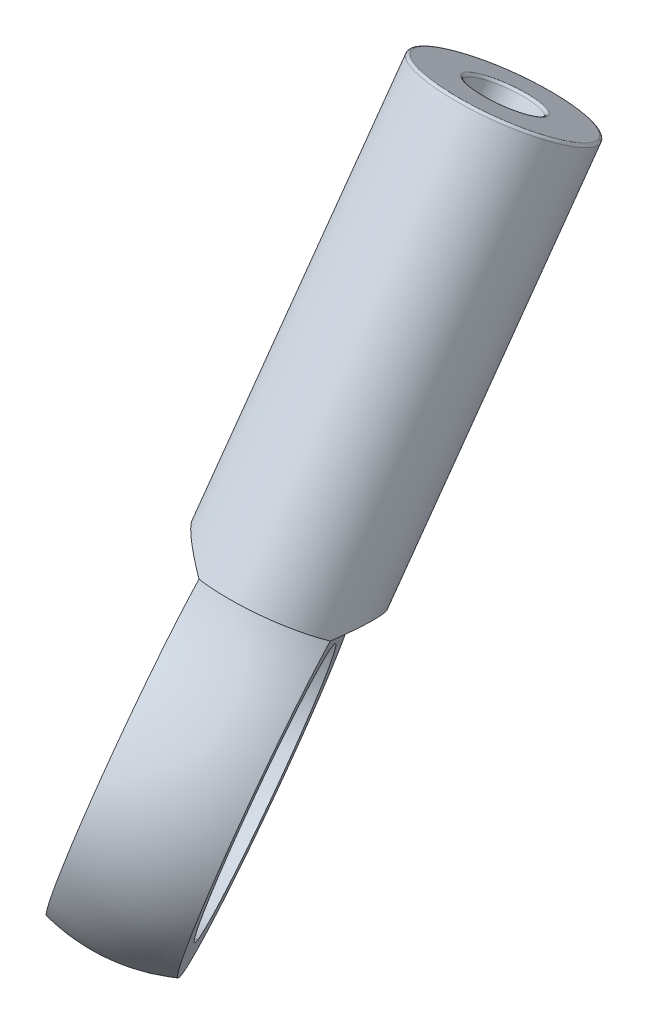
ISO-10303-21;
HEADER;
FILE_DESCRIPTION(('STEP AP214'),'2;1');
FILE_NAME('part.step','',(''),(''),'','','');
FILE_SCHEMA(('AUTOMOTIVE_DESIGN { 1 0 10303 214 1 1 1 1 }'));
ENDSEC;
DATA;
#1=APPLICATION_CONTEXT('core data for automotive mechanical design processes');
#2=APPLICATION_PROTOCOL_DEFINITION('international standard','automotive_design',2000,#1);
#3=PRODUCT_CONTEXT('',#1,'mechanical');
#4=PRODUCT('Part','Part','',(#3));
#5=PRODUCT_RELATED_PRODUCT_CATEGORY('part','',(#4));
#6=PRODUCT_DEFINITION_FORMATION('','',#4);
#7=PRODUCT_DEFINITION_CONTEXT('part definition',#1,'design');
#8=PRODUCT_DEFINITION('design','',#6,#7);
#9=PRODUCT_DEFINITION_SHAPE('','',#8);
#10=(LENGTH_UNIT() NAMED_UNIT(*) SI_UNIT(.MILLI.,.METRE.));
#11=(NAMED_UNIT(*) PLANE_ANGLE_UNIT() SI_UNIT($,.RADIAN.));
#12=(NAMED_UNIT(*) SI_UNIT($,.STERADIAN.) SOLID_ANGLE_UNIT());
#13=UNCERTAINTY_MEASURE_WITH_UNIT(LENGTH_MEASURE(1.E-05),#10,'distance_accuracy_value','');
#14=(GEOMETRIC_REPRESENTATION_CONTEXT(3) GLOBAL_UNCERTAINTY_ASSIGNED_CONTEXT((#13)) GLOBAL_UNIT_ASSIGNED_CONTEXT((#10,
#11,#12)) REPRESENTATION_CONTEXT('',''));
#15=CARTESIAN_POINT('',(0.,0.,0.));
#16=DIRECTION('',(0.,0.,1.));
#17=DIRECTION('',(1.,0.,0.));
#18=AXIS2_PLACEMENT_3D('',#15,#16,#17);
#19=CARTESIAN_POINT('',(-84.7050146954666,218.885693840539,236.71936028942));
#20=DIRECTION('',(0.0573815467655009,0.854989132198698,-0.515461872414358));
#21=DIRECTION('',(-0.84059085163714,0.319932763466913,0.437092721289627));
#22=AXIS2_PLACEMENT_3D('',#19,#20,#21);
#23=PLANE('',#22);
#24=CARTESIAN_POINT('',(-84.7050146954666,218.885693840539,236.71936028942));
#25=DIRECTION('',(0.0573815467655009,0.854989132198698,-0.515461872414358));
#26=DIRECTION('',(0.84059085163714,-0.319932763466913,-0.437092721289627));
#27=AXIS2_PLACEMENT_3D('',#24,#25,#26);
#28=CIRCLE('',#27,1.25);
#29=CARTESIAN_POINT('',(-83.6542761309202,218.485777886205,236.172994387808));
#30=VERTEX_POINT('',#29);
#31=CARTESIAN_POINT('',(-85.7557532600131,219.285609794872,237.265726191032));
#32=VERTEX_POINT('',#31);
#33=EDGE_CURVE('E171',#30,#32,#28,.T.);
#34=ORIENTED_EDGE('',*,*,#33,.T.);
#35=CARTESIAN_POINT('',(-84.7050146954666,218.885693840539,236.71936028942));
#36=DIRECTION('',(0.0573815467655009,0.854989132198698,-0.515461872414358));
#37=DIRECTION('',(-0.84059085163714,0.319932763466913,0.437092721289627));
#38=AXIS2_PLACEMENT_3D('',#35,#36,#37);
#39=CIRCLE('',#38,1.25);
#40=EDGE_CURVE('E11',#32,#30,#39,.T.);
#41=ORIENTED_EDGE('',*,*,#40,.T.);
#42=EDGE_LOOP('',(#34,#41));
#43=FACE_BOUND('',#42,.T.);
#44=ADVANCED_FACE('F43',(#43),#23,.T.);
#45=CARTESIAN_POINT('',(-84.1311992278116,227.435585162526,231.564741565276));
#46=DIRECTION('',(-0.0573815467655009,-0.854989132198698,0.515461872414358));
#47=DIRECTION('',(-0.84059085163714,0.319932763466913,0.437092721289627));
#48=AXIS2_PLACEMENT_3D('',#45,#46,#47);
#49=CYLINDRICAL_SURFACE('',#48,1.25);
#50=DIRECTION('',(-0.0573815467655009,-0.854989132198698,0.515461872414358));
#51=VECTOR('',#50,1.);
#52=CARTESIAN_POINT('',(-83.0861988179418,226.950170294972,231.069921850906));
#53=LINE('',#52,#51);
#54=CARTESIAN_POINT('',(-83.0861988179429,226.950170294971,231.069921850904));
#55=VERTEX_POINT('',#54);
#56=EDGE_CURVE('E54',#55,#30,#53,.T.);
#57=ORIENTED_EDGE('',*,*,#56,.T.);
#58=ORIENTED_EDGE('',*,*,#40,.F.);
#59=DIRECTION('',(-0.0573815467655009,-0.854989132198698,0.515461872414358));
#60=VECTOR('',#59,1.);
#61=CARTESIAN_POINT('',(-85.1876759470346,227.75000220364,232.16265365413));
#62=LINE('',#61,#60);
#63=CARTESIAN_POINT('',(-85.1876759470335,227.75000220364,232.162653654132));
#64=VERTEX_POINT('',#63);
#65=EDGE_CURVE('E196',#64,#32,#62,.T.);
#66=ORIENTED_EDGE('',*,*,#65,.F.);
#67=CARTESIAN_POINT('',(-84.1369373824882,227.350086249306,231.616287752518));
#68=DIRECTION('',(-0.0573815467655009,-0.854989132198698,0.515461872414358));
#69=DIRECTION('',(0.840590851637141,-0.319932763466913,-0.437092721289627));
#70=AXIS2_PLACEMENT_3D('',#67,#68,#69);
#71=CIRCLE('',#70,1.25);
#72=EDGE_CURVE('E194',#55,#64,#71,.T.);
#73=ORIENTED_EDGE('',*,*,#72,.F.);
#74=EDGE_LOOP('',(#57,#58,#66,#73));
#75=FACE_BOUND('',#74,.T.);
#76=ADVANCED_FACE('F441',(#75),#49,.F.);
#77=CARTESIAN_POINT('',(-84.1311992278116,227.435585162526,231.564741565276));
#78=DIRECTION('',(-0.0573815467655009,-0.854989132198698,0.515461872414358));
#79=DIRECTION('',(-0.84059085163714,0.319932763466913,0.437092721289627));
#80=AXIS2_PLACEMENT_3D('',#77,#78,#79);
#81=CYLINDRICAL_SURFACE('',#80,1.25);
#82=ORIENTED_EDGE('',*,*,#65,.T.);
#83=ORIENTED_EDGE('',*,*,#33,.F.);
#84=ORIENTED_EDGE('',*,*,#56,.F.);
#85=CARTESIAN_POINT('',(-84.1369373824882,227.350086249306,231.616287752518));
#86=DIRECTION('',(-0.0573815467655009,-0.854989132198698,0.515461872414358));
#87=DIRECTION('',(-0.840590851637141,0.319932763466913,0.437092721289627));
#88=AXIS2_PLACEMENT_3D('',#85,#86,#87);
#89=CIRCLE('',#88,1.25);
#90=EDGE_CURVE('E195',#64,#55,#89,.T.);
#91=ORIENTED_EDGE('',*,*,#90,.F.);
#92=EDGE_LOOP('',(#82,#83,#84,#91));
#93=FACE_BOUND('',#92,.T.);
#94=ADVANCED_FACE('F473',(#93),#81,.F.);
#95=CARTESIAN_POINT('',(-84.1369373824882,227.350086249306,231.616287752518));
#96=DIRECTION('',(0.0573815467655009,0.854989132198698,-0.515461872414358));
#97=DIRECTION('',(0.831050621240359,-0.327016999084949,-0.449905264745243));
#98=AXIS2_PLACEMENT_3D('',#95,#96,#97);
#99=TOROIDAL_SURFACE('',#98,1.35,0.1);
#100=CARTESIAN_POINT('',(-83.002139732783,226.918177018622,231.02621257877));
#101=DIRECTION('',(0.538622667774896,0.408211477889529,0.737054279601103));
#102=DIRECTION('',(0.0573815467624861,0.854989132199845,-0.515461872412791));
#103=AXIS2_PLACEMENT_3D('',#100,#101,#102);
#104=CIRCLE('',#103,0.100000000000003);
#105=CARTESIAN_POINT('',(-82.9964015781033,227.003675931844,230.974666391533));
#106=VERTEX_POINT('',#105);
#107=EDGE_CURVE('E188',#106,#55,#104,.T.);
#108=ORIENTED_EDGE('',*,*,#107,.T.);
#109=ORIENTED_EDGE('',*,*,#72,.T.);
#110=CARTESIAN_POINT('',(-85.2717350321934,227.78199547999,232.206362926266));
#111=DIRECTION('',(-0.538622667774895,-0.408211477889529,-0.737054279601103));
#112=DIRECTION('',(0.0573815467685139,0.854989132197551,-0.515461872415925));
#113=AXIS2_PLACEMENT_3D('',#110,#111,#112);
#114=CIRCLE('',#113,0.100000000000003);
#115=CARTESIAN_POINT('',(-85.26599687752,227.867494393207,232.15481673902));
#116=VERTEX_POINT('',#115);
#117=EDGE_CURVE('E255',#116,#64,#114,.T.);
#118=ORIENTED_EDGE('',*,*,#117,.F.);
#119=CARTESIAN_POINT('',(-84.1311992278116,227.435585162526,231.564741565276));
#120=DIRECTION('',(-0.0573815467655009,-0.854989132198698,0.515461872414358));
#121=DIRECTION('',(0.84059085163714,-0.319932763466913,-0.437092721289627));
#122=AXIS2_PLACEMENT_3D('',#119,#120,#121);
#123=CIRCLE('',#122,1.35);
#124=EDGE_CURVE('E229',#106,#116,#123,.T.);
#125=ORIENTED_EDGE('',*,*,#124,.F.);
#126=EDGE_LOOP('',(#108,#109,#118,#125));
#127=FACE_BOUND('',#126,.T.);
#128=ADVANCED_FACE('F496',(#127),#99,.T.);
#129=CARTESIAN_POINT('',(-84.1369373824882,227.350086249306,231.616287752518));
#130=DIRECTION('',(0.0573815467655009,0.854989132198698,-0.515461872414358));
#131=DIRECTION('',(-0.831050621240359,0.327016999084949,0.449905264745243));
#132=AXIS2_PLACEMENT_3D('',#129,#130,#131);
#133=TOROIDAL_SURFACE('',#132,1.35,0.1);
#134=ORIENTED_EDGE('',*,*,#117,.T.);
#135=ORIENTED_EDGE('',*,*,#90,.T.);
#136=ORIENTED_EDGE('',*,*,#107,.F.);
#137=CARTESIAN_POINT('',(-84.1311992278116,227.435585162526,231.564741565276));
#138=DIRECTION('',(-0.0573815467655009,-0.854989132198698,0.515461872414358));
#139=DIRECTION('',(-0.84059085163714,0.319932763466913,0.437092721289627));
#140=AXIS2_PLACEMENT_3D('',#137,#138,#139);
#141=CIRCLE('',#140,1.35);
#142=EDGE_CURVE('E139',#116,#106,#141,.T.);
#143=ORIENTED_EDGE('',*,*,#142,.F.);
#144=EDGE_LOOP('',(#134,#135,#136,#143));
#145=FACE_BOUND('',#144,.T.);
#146=ADVANCED_FACE('F509',(#145),#133,.T.);
#147=CARTESIAN_POINT('',(-84.1311992278116,227.435585162526,231.564741565276));
#148=DIRECTION('',(0.0573815467655009,0.854989132198698,-0.515461872414358));
#149=DIRECTION('',(-0.84059085163714,0.319932763466913,0.437092721289627));
#150=AXIS2_PLACEMENT_3D('',#147,#148,#149);
#151=PLANE('',#150);
#152=ORIENTED_EDGE('',*,*,#142,.T.);
#153=ORIENTED_EDGE('',*,*,#124,.T.);
#154=EDGE_LOOP('',(#152,#153));
#155=FACE_BOUND('',#154,.T.);
#156=CARTESIAN_POINT('',(-84.1311992278116,227.435585162526,231.564741565276));
#157=DIRECTION('',(0.0573815467655009,0.854989132198698,-0.515461872414358));
#158=DIRECTION('',(-0.84059085163714,0.319932763466913,0.437092721289627));
#159=AXIS2_PLACEMENT_3D('',#156,#157,#158);
#160=CIRCLE('',#159,2.87);
#161=CARTESIAN_POINT('',(-86.5436949720104,228.353792193676,232.819197675377));
#162=VERTEX_POINT('',#161);
#163=CARTESIAN_POINT('',(-81.7187034836129,226.517378131376,230.310285455175));
#164=VERTEX_POINT('',#163);
#165=EDGE_CURVE('E128',#162,#164,#160,.T.);
#166=ORIENTED_EDGE('',*,*,#165,.T.);
#167=CARTESIAN_POINT('',(-84.1311992278116,227.435585162526,231.564741565276));
#168=DIRECTION('',(0.0573815467655009,0.854989132198698,-0.515461872414358));
#169=DIRECTION('',(0.84059085163714,-0.319932763466913,-0.437092721289627));
#170=AXIS2_PLACEMENT_3D('',#167,#168,#169);
#171=CIRCLE('',#170,2.87);
#172=EDGE_CURVE('E140',#164,#162,#171,.T.);
#173=ORIENTED_EDGE('',*,*,#172,.T.);
#174=EDGE_LOOP('',(#166,#173));
#175=FACE_BOUND('',#174,.T.);
#176=ADVANCED_FACE('F142',(#155,#175),#151,.T.);
#177=CARTESIAN_POINT('',(-84.1369373824882,227.350086249306,231.616287752518));
#178=DIRECTION('',(0.0573815467655009,0.854989132198698,-0.515461872414358));
#179=DIRECTION('',(-0.843368223955944,0.317815021602849,0.433270874701932));
#180=AXIS2_PLACEMENT_3D('',#177,#178,#179);
#181=TOROIDAL_SURFACE('',#180,2.87,0.1);
#182=CARTESIAN_POINT('',(-86.5494331266873,228.268293280456,232.870743862618));
#183=DIRECTION('',(0.538622667768864,0.408211477891825,0.737054279604239));
#184=DIRECTION('',(0.0573815467654681,0.85498913219871,-0.515461872414341));
#185=AXIS2_PLACEMENT_3D('',#182,#183,#184);
#186=CIRCLE('',#185,0.100000000000006);
#187=CARTESIAN_POINT('',(-86.6334922118506,228.300286556803,232.914453134748));
#188=VERTEX_POINT('',#187);
#189=EDGE_CURVE('E133',#162,#188,#186,.T.);
#190=ORIENTED_EDGE('',*,*,#189,.T.);
#191=CARTESIAN_POINT('',(-84.1369373824882,227.350086249306,231.616287752518));
#192=DIRECTION('',(0.0573815467655009,0.854989132198698,-0.515461872414358));
#193=DIRECTION('',(-0.84059085163714,0.319932763466913,0.437092721289627));
#194=AXIS2_PLACEMENT_3D('',#191,#192,#193);
#195=CIRCLE('',#194,2.97);
#196=CARTESIAN_POINT('',(-81.6403825531258,226.399885941809,230.318122370288));
#197=VERTEX_POINT('',#196);
#198=EDGE_CURVE('E187',#188,#197,#195,.T.);
#199=ORIENTED_EDGE('',*,*,#198,.T.);
#200=CARTESIAN_POINT('',(-81.7244416382891,226.431879218156,230.361831642417));
#201=DIRECTION('',(-0.538622667768864,-0.408211477891825,-0.737054279604239));
#202=DIRECTION('',(0.0573815467655337,0.854989132198685,-0.515461872414375));
#203=AXIS2_PLACEMENT_3D('',#200,#201,#202);
#204=CIRCLE('',#203,0.100000000000006);
#205=EDGE_CURVE('E135',#164,#197,#204,.T.);
#206=ORIENTED_EDGE('',*,*,#205,.F.);
#207=ORIENTED_EDGE('',*,*,#165,.F.);
#208=EDGE_LOOP('',(#190,#199,#206,#207));
#209=FACE_BOUND('',#208,.T.);
#210=ADVANCED_FACE('F130',(#209),#181,.T.);
#211=CARTESIAN_POINT('',(-84.1369373824882,227.350086249306,231.616287752518));
#212=DIRECTION('',(0.0573815467655009,0.854989132198698,-0.515461872414358));
#213=DIRECTION('',(0.843368223955944,-0.317815021602849,-0.433270874701932));
#214=AXIS2_PLACEMENT_3D('',#211,#212,#213);
#215=TOROIDAL_SURFACE('',#214,2.87,0.1);
#216=ORIENTED_EDGE('',*,*,#205,.T.);
#217=CARTESIAN_POINT('',(-84.1369373824882,227.350086249306,231.616287752518));
#218=DIRECTION('',(0.0573815467655009,0.854989132198698,-0.515461872414358));
#219=DIRECTION('',(0.840590851637141,-0.319932763466913,-0.437092721289627));
#220=AXIS2_PLACEMENT_3D('',#217,#218,#219);
#221=CIRCLE('',#220,2.97);
#222=EDGE_CURVE('E149',#197,#188,#221,.T.);
#223=ORIENTED_EDGE('',*,*,#222,.T.);
#224=ORIENTED_EDGE('',*,*,#189,.F.);
#225=ORIENTED_EDGE('',*,*,#172,.F.);
#226=EDGE_LOOP('',(#216,#223,#224,#225));
#227=FACE_BOUND('',#226,.T.);
#228=ADVANCED_FACE('F147',(#227),#215,.T.);
#229=CARTESIAN_POINT('',(-90.5966985761905,211.761818376705,235.201754585123));
#230=DIRECTION('',(0.634962372228855,0.378341986647296,-0.673557812658484));
#231=DIRECTION('',(0.53862266776914,0.40821147789172,0.737054279604096));
#232=AXIS2_PLACEMENT_3D('',#229,#230,#231);
#233=PLANE('',#232);
#234=CARTESIAN_POINT('',(-87.8963160175964,213.808384964187,238.896973224219));
#235=CARTESIAN_POINT('',(-88.0751849369742,214.770937280648,239.269025804689));
#236=CARTESIAN_POINT('',(-87.9247858897519,215.484568933768,239.811658591827));
#237=CARTESIAN_POINT('',(-87.4704963009295,215.828866037364,240.433311013192));
#238=(BOUNDED_CURVE() B_SPLINE_CURVE(3,(#234,#235,#236,#237),.UNSPECIFIED.,.F.,
.F.) B_SPLINE_CURVE_WITH_KNOTS((4,4),(5.45575213397751,6.28318530717959),
.UNSPECIFIED.) CURVE() GEOMETRIC_REPRESENTATION_ITEM() RATIONAL_B_SPLINE_CURVE((1.,
0.943755350696507,0.943755350696507,1.)) REPRESENTATION_ITEM(''));
#239=CARTESIAN_POINT('',(-87.8963160175964,213.808384964187,238.896973224219));
#240=VERTEX_POINT('',#239);
#241=CARTESIAN_POINT('',(-87.4704963009295,215.828866037364,240.433311013192));
#242=VERTEX_POINT('',#241);
#243=EDGE_CURVE('E222',#240,#242,#238,.T.);
#244=ORIENTED_EDGE('',*,*,#243,.F.);
#245=DIRECTION('',(0.53862266776914,0.40821147789172,0.737054279604096));
#246=VECTOR('',#245,1.);
#247=CARTESIAN_POINT('',(-87.8963160175964,213.808384964187,238.896973224218));
#248=LINE('',#247,#246);
#249=CARTESIAN_POINT('',(-85.5409147189089,215.593497070864,242.120117572326));
#250=VERTEX_POINT('',#249);
#251=EDGE_CURVE('E289',#240,#250,#248,.T.);
#252=ORIENTED_EDGE('',*,*,#251,.T.);
#253=CARTESIAN_POINT('',(-87.4704963009295,215.828866037364,240.433311013192));
#254=CARTESIAN_POINT('',(-87.016206712107,216.17316314096,241.054963434558));
#255=CARTESIAN_POINT('',(-86.334680657501,216.090031085488,241.650741622867));
#256=CARTESIAN_POINT('',(-85.5409147189089,215.593497070864,242.120117572326));
#257=(BOUNDED_CURVE() B_SPLINE_CURVE(3,(#253,#254,#255,#256),.UNSPECIFIED.,.F.,
.F.) B_SPLINE_CURVE_WITH_KNOTS((4,4),(0.,0.827433173202039),
.UNSPECIFIED.) CURVE() GEOMETRIC_REPRESENTATION_ITEM() RATIONAL_B_SPLINE_CURVE((1.,
0.943755350696504,0.943755350696504,1.)) REPRESENTATION_ITEM(''));
#258=EDGE_CURVE('E158',#242,#250,#257,.T.);
#259=ORIENTED_EDGE('',*,*,#258,.F.);
#260=EDGE_LOOP('',(#244,#252,#259));
#261=FACE_BOUND('',#260,.T.);
#262=ADVANCED_FACE('F457',(#261),#233,.F.);
#263=CARTESIAN_POINT('',(-85.0412705595125,213.875457525855,239.739966861768));
#264=DIRECTION('',(-0.0573815467655009,-0.854989132198698,0.515461872414358));
#265=DIRECTION('',(-0.84059085163714,0.319932763466913,0.437092721289627));
#266=AXIS2_PLACEMENT_3D('',#263,#264,#265);
#267=CYLINDRICAL_SURFACE('',#266,2.97);
#268=DIRECTION('',(0.0573815467655009,0.854989132198698,-0.515461872414358));
#269=VECTOR('',#268,1.);
#270=CARTESIAN_POINT('',(-82.4773866422048,213.928465422371,237.836980248732));
#271=LINE('',#270,#269);
#272=CARTESIAN_POINT('',(-82.4773866422048,213.928465422371,237.836980248732));
#273=VERTEX_POINT('',#272);
#274=EDGE_CURVE('E250',#273,#197,#271,.T.);
#275=ORIENTED_EDGE('',*,*,#274,.T.);
#276=ORIENTED_EDGE('',*,*,#198,.F.);
#277=DIRECTION('',(0.0573815467655009,0.854989132198698,-0.515461872414358));
#278=VECTOR('',#277,1.);
#279=CARTESIAN_POINT('',(-87.4704963009295,215.828866037364,240.433311013193));
#280=LINE('',#279,#278);
#281=EDGE_CURVE('E220',#242,#188,#280,.T.);
#282=ORIENTED_EDGE('',*,*,#281,.F.);
#283=ORIENTED_EDGE('',*,*,#258,.T.);
#284=CARTESIAN_POINT('',(-85.029027756462,214.057876162957,239.62998902848));
#285=DIRECTION('',(0.0573815467655009,0.854989132198698,-0.515461872414358));
#286=DIRECTION('',(-0.172352512608388,0.517044076736342,0.838427119140023));
#287=AXIS2_PLACEMENT_3D('',#284,#285,#286);
#288=CIRCLE('',#287,2.97);
#289=CARTESIAN_POINT('',(-82.1617394953276,214.307367361727,240.363004832742));
#290=VERTEX_POINT('',#289);
#291=EDGE_CURVE('E218',#250,#290,#288,.T.);
#292=ORIENTED_EDGE('',*,*,#291,.T.);
#293=CARTESIAN_POINT('',(-82.1617394953276,214.307367361727,240.363004832742));
#294=CARTESIAN_POINT('',(-81.9116108344718,214.406590266767,239.350821725289));
#295=CARTESIAN_POINT('',(-82.0230970533824,214.272762525967,238.458632670098));
#296=CARTESIAN_POINT('',(-82.4773866422048,213.928465422371,237.836980248732));
#297=(BOUNDED_CURVE() B_SPLINE_CURVE(3,(#293,#294,#295,#296),.UNSPECIFIED.,.F.,
.F.) B_SPLINE_CURVE_WITH_KNOTS((4,4),(2.31415948038766,3.14159265358983),
.UNSPECIFIED.) CURVE() GEOMETRIC_REPRESENTATION_ITEM() RATIONAL_B_SPLINE_CURVE((1.,
0.943755350696495,0.943755350696495,1.)) REPRESENTATION_ITEM(''));
#298=EDGE_CURVE('E232',#290,#273,#297,.T.);
#299=ORIENTED_EDGE('',*,*,#298,.T.);
#300=EDGE_LOOP('',(#275,#276,#282,#283,#292,#299));
#301=FACE_BOUND('',#300,.T.);
#302=ADVANCED_FACE('F331',(#301),#267,.T.);
#303=CARTESIAN_POINT('',(-85.32817829334,209.600511864861,242.31727622384));
#304=DIRECTION('',(-0.53862266776914,-0.40821147789172,-0.737054279604096));
#305=DIRECTION('',(0.84059085163714,-0.319932763466913,-0.437092721289627));
#306=AXIS2_PLACEMENT_3D('',#303,#304,#305);
#307=SPHERICAL_SURFACE('',#306,5.);
#308=CARTESIAN_POINT('',(-83.6385906815493,208.957447010292,241.438719854048));
#309=DIRECTION('',(-0.84059085163714,0.319932763466913,0.437092721289627));
#310=DIRECTION('',(0.0573815467655008,0.854989132198698,-0.515461872414358));
#311=AXIS2_PLACEMENT_3D('',#308,#309,#310);
#312=CIRCLE('',#311,4.5781983355901);
#313=CARTESIAN_POINT('',(-83.375886579654,212.871756832272,239.0788331677));
#314=VERTEX_POINT('',#313);
#315=CARTESIAN_POINT('',(-83.9012947834447,205.043137188313,243.798606540395));
#316=VERTEX_POINT('',#315);
#317=EDGE_CURVE('E172',#314,#316,#312,.T.);
#318=ORIENTED_EDGE('',*,*,#317,.F.);
#319=CARTESIAN_POINT('',(-85.32817829334,209.600511864861,242.31727622384));
#320=DIRECTION('',(-0.53862266776914,-0.408211477891724,-0.737054279604094));
#321=DIRECTION('',(-0.285376701979052,0.911474935309639,-0.296266063311088));
#322=AXIS2_PLACEMENT_3D('',#319,#320,#321);
#323=CIRCLE('',#322,5.);
#324=CARTESIAN_POINT('',(-86.7550618032352,214.157886541409,240.835945907285));
#325=VERTEX_POINT('',#324);
#326=EDGE_CURVE('E47',#325,#314,#323,.T.);
#327=ORIENTED_EDGE('',*,*,#326,.F.);
#328=CARTESIAN_POINT('',(-87.0177659051306,210.24357671943,243.195832593632));
#329=DIRECTION('',(0.84059085163714,-0.319932763466913,-0.437092721289627));
#330=DIRECTION('',(-0.0573815467654975,-0.854989132198695,0.515461872414363));
#331=AXIS2_PLACEMENT_3D('',#328,#329,#330);
#332=CIRCLE('',#331,4.5781983355901);
#333=CARTESIAN_POINT('',(-87.280470007026,206.32926689745,245.55571927998));
#334=VERTEX_POINT('',#333);
#335=EDGE_CURVE('E162',#334,#325,#332,.T.);
#336=ORIENTED_EDGE('',*,*,#335,.F.);
#337=CARTESIAN_POINT('',(-85.32817829334,209.600511864861,242.31727622384));
#338=DIRECTION('',(0.53862266776914,0.40821147789172,0.737054279604096));
#339=DIRECTION('',(-0.0573815467655014,-0.854989132198698,0.515461872414359));
#340=AXIS2_PLACEMENT_3D('',#337,#338,#339);
#341=CIRCLE('',#340,5.);
#342=EDGE_CURVE('E230',#334,#316,#341,.T.);
#343=ORIENTED_EDGE('',*,*,#342,.T.);
#344=EDGE_LOOP('',(#318,#327,#336,#343));
#345=FACE_BOUND('',#344,.T.);
#346=ADVANCED_FACE('F456',(#345),#307,.F.);
#347=CARTESIAN_POINT('',(-85.32817829334,209.600511864861,242.31727622384));
#348=DIRECTION('',(-0.53862266776914,-0.40821147789172,-0.737054279604096));
#349=DIRECTION('',(0.84059085163714,-0.319932763466913,-0.437092721289627));
#350=AXIS2_PLACEMENT_3D('',#347,#348,#349);
#351=SPHERICAL_SURFACE('',#350,5.);
#352=ORIENTED_EDGE('',*,*,#342,.F.);
#353=CARTESIAN_POINT('',(-87.0177659051306,210.24357671943,243.195832593632));
#354=DIRECTION('',(0.84059085163714,-0.319932763466913,-0.437092721289627));
#355=DIRECTION('',(0.057381546765508,0.854989132198703,-0.515461872414349));
#356=AXIS2_PLACEMENT_3D('',#353,#354,#355);
#357=CIRCLE('',#356,4.5781983355901);
#358=EDGE_CURVE('E283',#325,#334,#357,.T.);
#359=ORIENTED_EDGE('',*,*,#358,.F.);
#360=ORIENTED_EDGE('',*,*,#326,.T.);
#361=CARTESIAN_POINT('',(-83.6385906815493,208.957447010292,241.438719854048));
#362=DIRECTION('',(-0.84059085163714,0.319932763466913,0.437092721289627));
#363=DIRECTION('',(-0.0573815467655009,-0.854989132198698,0.515461872414358));
#364=AXIS2_PLACEMENT_3D('',#361,#362,#363);
#365=CIRCLE('',#364,4.57819833559011);
#366=EDGE_CURVE('E177',#316,#314,#365,.T.);
#367=ORIENTED_EDGE('',*,*,#366,.F.);
#368=EDGE_LOOP('',(#352,#359,#360,#367));
#369=FACE_BOUND('',#368,.T.);
#370=ADVANCED_FACE('F465',(#369),#351,.F.);
#371=CARTESIAN_POINT('',(-86.3554698501427,210.989342781551,232.530189435583));
#372=DIRECTION('',(-0.553812610563138,0.830795239789707,-0.0554153581961316));
#373=DIRECTION('',(-0.53862266776914,-0.40821147789172,-0.737054279604096));
#374=AXIS2_PLACEMENT_3D('',#371,#372,#373);
#375=PLANE('',#374);
#376=DIRECTION('',(0.53862266776914,0.40821147789172,0.737054279604096));
#377=VECTOR('',#376,1.);
#378=CARTESIAN_POINT('',(-84.5171407940151,212.52225525505,237.139860484634));
#379=LINE('',#378,#377);
#380=CARTESIAN_POINT('',(-84.5171407940151,212.52225525505,237.139860484634));
#381=VERTEX_POINT('',#380);
#382=EDGE_CURVE('E167',#381,#290,#379,.T.);
#383=ORIENTED_EDGE('',*,*,#382,.F.);
#384=CARTESIAN_POINT('',(-82.4773866422048,213.928465422371,237.836980248732));
#385=CARTESIAN_POINT('',(-82.9316762310273,213.584168318775,237.215327827366));
#386=CARTESIAN_POINT('',(-83.6521151139451,213.087496461927,236.969105907111));
#387=CARTESIAN_POINT('',(-84.5171407940151,212.52225525505,237.139860484634));
#388=(BOUNDED_CURVE() B_SPLINE_CURVE(3,(#384,#385,#386,#387),.UNSPECIFIED.,.F.,
.F.) B_SPLINE_CURVE_WITH_KNOTS((4,4),(3.14159265358984,3.96902582679209),
.UNSPECIFIED.) CURVE() GEOMETRIC_REPRESENTATION_ITEM() RATIONAL_B_SPLINE_CURVE((1.,
0.943755350696485,0.943755350696485,1.)) REPRESENTATION_ITEM(''));
#389=EDGE_CURVE('E240',#273,#381,#388,.T.);
#390=ORIENTED_EDGE('',*,*,#389,.F.);
#391=ORIENTED_EDGE('',*,*,#298,.F.);
#392=EDGE_LOOP('',(#383,#390,#391));
#393=FACE_BOUND('',#392,.T.);
#394=ADVANCED_FACE('F320',(#393),#375,.F.);
#395=CARTESIAN_POINT('',(-85.0412705595125,213.875457525855,239.739966861768));
#396=DIRECTION('',(-0.0573815467655009,-0.854989132198698,0.515461872414358));
#397=DIRECTION('',(-0.84059085163714,0.319932763466913,0.437092721289627));
#398=AXIS2_PLACEMENT_3D('',#395,#396,#397);
#399=CYLINDRICAL_SURFACE('',#398,2.97);
#400=CARTESIAN_POINT('',(-85.029027756462,214.057876162957,239.62998902848));
#401=DIRECTION('',(0.0573815467655009,0.854989132198698,-0.515461872414358));
#402=DIRECTION('',(0.172352512608388,-0.517044076736342,-0.838427119140023));
#403=AXIS2_PLACEMENT_3D('',#400,#401,#402);
#404=CIRCLE('',#403,2.97);
#405=EDGE_CURVE('E164',#381,#240,#404,.T.);
#406=ORIENTED_EDGE('',*,*,#405,.T.);
#407=ORIENTED_EDGE('',*,*,#243,.T.);
#408=ORIENTED_EDGE('',*,*,#281,.T.);
#409=ORIENTED_EDGE('',*,*,#222,.F.);
#410=ORIENTED_EDGE('',*,*,#274,.F.);
#411=ORIENTED_EDGE('',*,*,#389,.T.);
#412=EDGE_LOOP('',(#406,#407,#408,#409,#410,#411));
#413=FACE_BOUND('',#412,.T.);
#414=ADVANCED_FACE('F329',(#413),#399,.T.);
#415=CARTESIAN_POINT('',(-83.5700442979341,206.77028086876,252.368587449889));
#416=DIRECTION('',(0.84059085163714,-0.319932763466913,-0.437092721289627));
#417=DIRECTION('',(0.0573815467655009,0.854989132198698,-0.515461872414358));
#418=AXIS2_PLACEMENT_3D('',#415,#416,#417);
#419=PLANE('',#418);
#420=ORIENTED_EDGE('',*,*,#358,.T.);
#421=ORIENTED_EDGE('',*,*,#335,.T.);
#422=EDGE_LOOP('',(#420,#421));
#423=FACE_BOUND('',#422,.T.);
#424=CARTESIAN_POINT('',(-87.0177659051306,210.24357671943,243.195832593632));
#425=DIRECTION('',(0.84059085163714,-0.319932763466913,-0.437092721289627));
#426=DIRECTION('',(0.26123660451557,0.946334363324031,-0.190280606613696));
#427=AXIS2_PLACEMENT_3D('',#424,#425,#426);
#428=CIRCLE('',#427,5.65330876566989);
#429=CARTESIAN_POINT('',(-87.3421615064478,205.410059163818,246.109897715321));
#430=VERTEX_POINT('',#429);
#431=EDGE_CURVE('E176',#250,#430,#428,.T.);
#432=ORIENTED_EDGE('',*,*,#431,.F.);
#433=ORIENTED_EDGE('',*,*,#251,.F.);
#434=CARTESIAN_POINT('',(-87.0177659051306,210.24357671943,243.195832593632));
#435=DIRECTION('',(0.840590851637141,-0.319932763466913,-0.437092721289626));
#436=DIRECTION('',(-0.0573815467655008,-0.854989132198698,0.515461872414359));
#437=AXIS2_PLACEMENT_3D('',#434,#435,#436);
#438=CIRCLE('',#437,5.65330876566989);
#439=EDGE_CURVE('E168',#430,#240,#438,.T.);
#440=ORIENTED_EDGE('',*,*,#439,.F.);
#441=EDGE_LOOP('',(#432,#433,#440));
#442=FACE_BOUND('',#441,.T.);
#443=ADVANCED_FACE('F427',(#423,#442),#419,.F.);
#444=CARTESIAN_POINT('',(-85.32817829334,209.600511864861,242.31727622384));
#445=DIRECTION('',(-0.53862266776914,-0.40821147789172,-0.737054279604096));
#446=DIRECTION('',(0.84059085163714,-0.319932763466913,-0.437092721289627));
#447=AXIS2_PLACEMENT_3D('',#444,#445,#446);
#448=SPHERICAL_SURFACE('',#447,6.);
#449=ORIENTED_EDGE('',*,*,#431,.T.);
#450=CARTESIAN_POINT('',(-85.32817829334,209.600511864861,242.31727622384));
#451=DIRECTION('',(0.53862266776914,0.40821147789172,0.737054279604096));
#452=DIRECTION('',(-0.0573815467655007,-0.854989132198698,0.515461872414358));
#453=AXIS2_PLACEMENT_3D('',#450,#451,#452);
#454=CIRCLE('',#453,6.);
#455=CARTESIAN_POINT('',(-83.9629862828664,204.123929454681,244.352784975737));
#456=VERTEX_POINT('',#455);
#457=EDGE_CURVE('E178',#430,#456,#454,.T.);
#458=ORIENTED_EDGE('',*,*,#457,.T.);
#459=CARTESIAN_POINT('',(-83.6385906815493,208.957447010292,241.438719854048));
#460=DIRECTION('',(-0.840590851637141,0.319932763466913,0.437092721289627));
#461=DIRECTION('',(-0.0573815467655011,-0.854989132198698,0.515461872414358));
#462=AXIS2_PLACEMENT_3D('',#459,#460,#461);
#463=CIRCLE('',#462,5.65330876566989);
#464=EDGE_CURVE('E277',#456,#290,#463,.T.);
#465=ORIENTED_EDGE('',*,*,#464,.T.);
#466=ORIENTED_EDGE('',*,*,#291,.F.);
#467=EDGE_LOOP('',(#449,#458,#465,#466));
#468=FACE_BOUND('',#467,.T.);
#469=ADVANCED_FACE('F45',(#468),#448,.T.);
#470=CARTESIAN_POINT('',(-79.3301458728703,218.308988142603,242.87954662409));
#471=DIRECTION('',(-0.84059085163714,0.319932763466913,0.437092721289627));
#472=DIRECTION('',(0.53862266776914,0.40821147789172,0.737054279604096));
#473=AXIS2_PLACEMENT_3D('',#470,#471,#472);
#474=PLANE('',#473);
#475=ORIENTED_EDGE('',*,*,#366,.T.);
#476=ORIENTED_EDGE('',*,*,#317,.T.);
#477=EDGE_LOOP('',(#475,#476));
#478=FACE_BOUND('',#477,.T.);
#479=CARTESIAN_POINT('',(-83.6385906815493,208.957447010292,241.438719854048));
#480=DIRECTION('',(-0.84059085163714,0.319932763466913,0.437092721289627));
#481=DIRECTION('',(-0.155404586744109,0.630570236390597,-0.760414749592089));
#482=AXIS2_PLACEMENT_3D('',#479,#480,#481);
#483=CIRCLE('',#482,5.65330876566989);
#484=EDGE_CURVE('E182',#381,#456,#483,.T.);
#485=ORIENTED_EDGE('',*,*,#484,.F.);
#486=ORIENTED_EDGE('',*,*,#382,.T.);
#487=ORIENTED_EDGE('',*,*,#464,.F.);
#488=EDGE_LOOP('',(#485,#486,#487));
#489=FACE_BOUND('',#488,.T.);
#490=ADVANCED_FACE('F315',(#478,#489),#474,.F.);
#491=CARTESIAN_POINT('',(-85.32817829334,209.600511864861,242.31727622384));
#492=DIRECTION('',(-0.53862266776914,-0.40821147789172,-0.737054279604096));
#493=DIRECTION('',(0.84059085163714,-0.319932763466913,-0.437092721289627));
#494=AXIS2_PLACEMENT_3D('',#491,#492,#493);
#495=SPHERICAL_SURFACE('',#494,6.);
#496=ORIENTED_EDGE('',*,*,#484,.T.);
#497=ORIENTED_EDGE('',*,*,#457,.F.);
#498=ORIENTED_EDGE('',*,*,#439,.T.);
#499=ORIENTED_EDGE('',*,*,#405,.F.);
#500=EDGE_LOOP('',(#496,#497,#498,#499));
#501=FACE_BOUND('',#500,.T.);
#502=ADVANCED_FACE('F325',(#501),#495,.T.);
#503=CLOSED_SHELL('',(#44,#76,#94,#128,#146,#176,#210,#228,#262,#302,#346,#370,#394,#414,#443,
#469,#490,#502));
#504=MANIFOLD_SOLID_BREP('B2',#503);
#505=ADVANCED_BREP_SHAPE_REPRESENTATION('',(#18,#504),#14);
#506=SHAPE_DEFINITION_REPRESENTATION(#9,#505);
ENDSEC;
END-ISO-10303-21;
